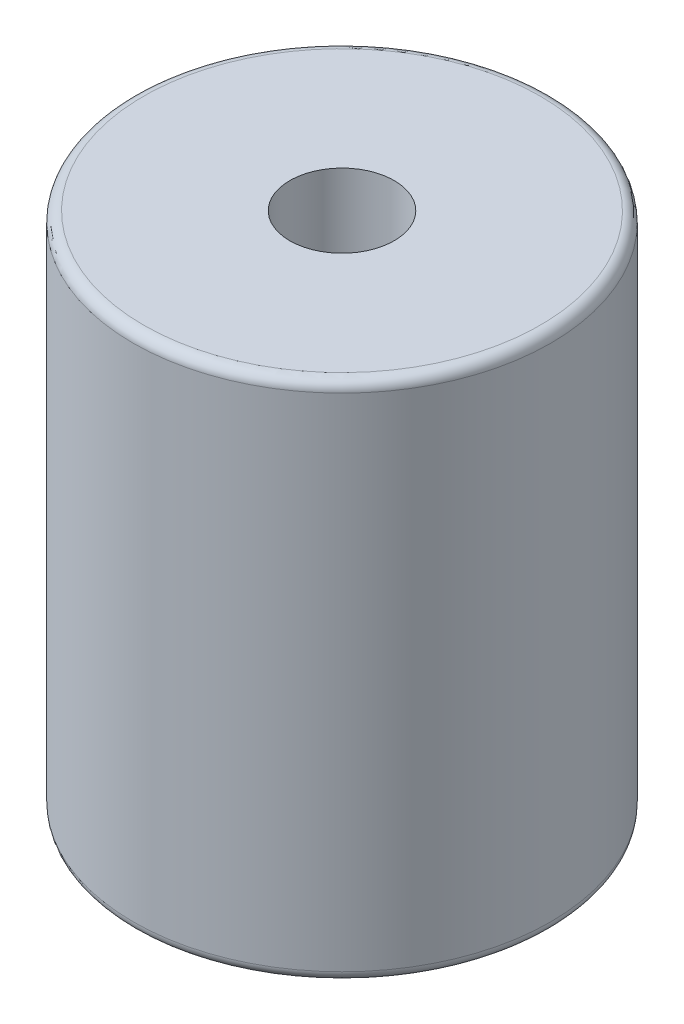
ISO-10303-21;
HEADER;
FILE_DESCRIPTION(('STEP AP214'),'2;1');
FILE_NAME('part.step','',(''),(''),'','','');
FILE_SCHEMA(('AUTOMOTIVE_DESIGN { 1 0 10303 214 1 1 1 1 }'));
ENDSEC;
DATA;
#1=APPLICATION_CONTEXT('core data for automotive mechanical design processes');
#2=APPLICATION_PROTOCOL_DEFINITION('international standard','automotive_design',2000,#1);
#3=PRODUCT_CONTEXT('',#1,'mechanical');
#4=PRODUCT('Part','Part','',(#3));
#5=PRODUCT_RELATED_PRODUCT_CATEGORY('part','',(#4));
#6=PRODUCT_DEFINITION_FORMATION('','',#4);
#7=PRODUCT_DEFINITION_CONTEXT('part definition',#1,'design');
#8=PRODUCT_DEFINITION('design','',#6,#7);
#9=PRODUCT_DEFINITION_SHAPE('','',#8);
#10=(LENGTH_UNIT() NAMED_UNIT(*) SI_UNIT(.MILLI.,.METRE.));
#11=(NAMED_UNIT(*) PLANE_ANGLE_UNIT() SI_UNIT($,.RADIAN.));
#12=(NAMED_UNIT(*) SI_UNIT($,.STERADIAN.) SOLID_ANGLE_UNIT());
#13=UNCERTAINTY_MEASURE_WITH_UNIT(LENGTH_MEASURE(1.E-05),#10,'distance_accuracy_value','');
#14=(GEOMETRIC_REPRESENTATION_CONTEXT(3) GLOBAL_UNCERTAINTY_ASSIGNED_CONTEXT((#13)) GLOBAL_UNIT_ASSIGNED_CONTEXT((#10,
#11,#12)) REPRESENTATION_CONTEXT('',''));
#15=CARTESIAN_POINT('',(0.,0.,0.));
#16=DIRECTION('',(0.,0.,1.));
#17=DIRECTION('',(1.,0.,0.));
#18=AXIS2_PLACEMENT_3D('',#15,#16,#17);
#19=CARTESIAN_POINT('',(0.,0.5,0.));
#20=DIRECTION('',(0.,1.,0.));
#21=DIRECTION('',(0.,0.,1.));
#22=AXIS2_PLACEMENT_3D('',#19,#20,#21);
#23=TOROIDAL_SURFACE('',#22,9.5,0.5);
#24=CARTESIAN_POINT('',(0.,0.5,0.));
#25=DIRECTION('',(0.,1.,0.));
#26=DIRECTION('',(0.,0.,1.));
#27=AXIS2_PLACEMENT_3D('',#24,#25,#26);
#28=CIRCLE('',#27,10.);
#29=CARTESIAN_POINT('',(0.,0.5,10.));
#30=VERTEX_POINT('',#29);
#31=EDGE_CURVE('E37',#30,#30,#28,.T.);
#32=ORIENTED_EDGE('',*,*,#31,.F.);
#33=EDGE_LOOP('',(#32));
#34=FACE_BOUND('',#33,.T.);
#35=CARTESIAN_POINT('',(0.,0.,0.));
#36=DIRECTION('',(0.,1.,0.));
#37=DIRECTION('',(0.,0.,1.));
#38=AXIS2_PLACEMENT_3D('',#35,#36,#37);
#39=CIRCLE('',#38,9.5);
#40=CARTESIAN_POINT('',(0.,0.,9.5));
#41=VERTEX_POINT('',#40);
#42=EDGE_CURVE('E10',#41,#41,#39,.F.);
#43=ORIENTED_EDGE('',*,*,#42,.F.);
#44=EDGE_LOOP('',(#43));
#45=FACE_BOUND('',#44,.T.);
#46=ADVANCED_FACE('F31',(#34,#45),#23,.T.);
#47=CARTESIAN_POINT('',(0.,24.5,0.));
#48=DIRECTION('',(0.,1.,0.));
#49=DIRECTION('',(0.,0.,1.));
#50=AXIS2_PLACEMENT_3D('',#47,#48,#49);
#51=TOROIDAL_SURFACE('',#50,9.5,0.5);
#52=CARTESIAN_POINT('',(0.,25.,0.));
#53=DIRECTION('',(0.,1.,0.));
#54=DIRECTION('',(0.,0.,1.));
#55=AXIS2_PLACEMENT_3D('',#52,#53,#54);
#56=CIRCLE('',#55,9.5);
#57=CARTESIAN_POINT('',(0.,25.,9.5));
#58=VERTEX_POINT('',#57);
#59=EDGE_CURVE('E45',#58,#58,#56,.T.);
#60=ORIENTED_EDGE('',*,*,#59,.F.);
#61=EDGE_LOOP('',(#60));
#62=FACE_BOUND('',#61,.T.);
#63=CARTESIAN_POINT('',(0.,24.5,0.));
#64=DIRECTION('',(0.,1.,0.));
#65=DIRECTION('',(0.,0.,1.));
#66=AXIS2_PLACEMENT_3D('',#63,#64,#65);
#67=CIRCLE('',#66,10.);
#68=CARTESIAN_POINT('',(0.,24.5,10.));
#69=VERTEX_POINT('',#68);
#70=EDGE_CURVE('E41',#69,#69,#67,.F.);
#71=ORIENTED_EDGE('',*,*,#70,.F.);
#72=EDGE_LOOP('',(#71));
#73=FACE_BOUND('',#72,.T.);
#74=ADVANCED_FACE('F80',(#62,#73),#51,.T.);
#75=CARTESIAN_POINT('',(0.,25.,0.));
#76=DIRECTION('',(0.,-1.,0.));
#77=DIRECTION('',(0.,0.,-1.));
#78=AXIS2_PLACEMENT_3D('',#75,#76,#77);
#79=CYLINDRICAL_SURFACE('',#78,10.);
#80=ORIENTED_EDGE('',*,*,#31,.T.);
#81=EDGE_LOOP('',(#80));
#82=FACE_BOUND('',#81,.T.);
#83=ORIENTED_EDGE('',*,*,#70,.T.);
#84=EDGE_LOOP('',(#83));
#85=FACE_BOUND('',#84,.T.);
#86=ADVANCED_FACE('F76',(#82,#85),#79,.T.);
#87=CARTESIAN_POINT('',(0.,25.,0.));
#88=DIRECTION('',(0.,1.,0.));
#89=DIRECTION('',(0.,0.,1.));
#90=AXIS2_PLACEMENT_3D('',#87,#88,#89);
#91=PLANE('',#90);
#92=CARTESIAN_POINT('',(0.,25.,0.));
#93=DIRECTION('',(0.,1.,0.));
#94=DIRECTION('',(0.,0.,1.));
#95=AXIS2_PLACEMENT_3D('',#92,#93,#94);
#96=CIRCLE('',#95,2.5);
#97=CARTESIAN_POINT('',(0.,25.,2.5));
#98=VERTEX_POINT('',#97);
#99=EDGE_CURVE('E57',#98,#98,#96,.T.);
#100=ORIENTED_EDGE('',*,*,#99,.F.);
#101=EDGE_LOOP('',(#100));
#102=FACE_BOUND('',#101,.T.);
#103=ORIENTED_EDGE('',*,*,#59,.T.);
#104=EDGE_LOOP('',(#103));
#105=FACE_BOUND('',#104,.T.);
#106=ADVANCED_FACE('F72',(#102,#105),#91,.T.);
#107=CARTESIAN_POINT('',(0.,0.,0.));
#108=DIRECTION('',(0.,1.,0.));
#109=DIRECTION('',(0.,0.,1.));
#110=AXIS2_PLACEMENT_3D('',#107,#108,#109);
#111=PLANE('',#110);
#112=CARTESIAN_POINT('',(0.,0.,0.));
#113=DIRECTION('',(0.,-1.,0.));
#114=DIRECTION('',(0.,0.,-1.));
#115=AXIS2_PLACEMENT_3D('',#112,#113,#114);
#116=CIRCLE('',#115,4.);
#117=CARTESIAN_POINT('',(0.,0.,-4.));
#118=VERTEX_POINT('',#117);
#119=EDGE_CURVE('E51',#118,#118,#116,.T.);
#120=ORIENTED_EDGE('',*,*,#119,.F.);
#121=EDGE_LOOP('',(#120));
#122=FACE_BOUND('',#121,.T.);
#123=ORIENTED_EDGE('',*,*,#42,.T.);
#124=EDGE_LOOP('',(#123));
#125=FACE_BOUND('',#124,.T.);
#126=ADVANCED_FACE('F75',(#122,#125),#111,.F.);
#127=CARTESIAN_POINT('',(0.,12.5,0.));
#128=DIRECTION('',(0.,-1.,0.));
#129=DIRECTION('',(0.,0.,-1.));
#130=AXIS2_PLACEMENT_3D('',#127,#128,#129);
#131=CYLINDRICAL_SURFACE('',#130,4.);
#132=CARTESIAN_POINT('',(0.,12.5,0.));
#133=DIRECTION('',(0.,-1.,0.));
#134=DIRECTION('',(0.,0.,-1.));
#135=AXIS2_PLACEMENT_3D('',#132,#133,#134);
#136=CIRCLE('',#135,4.);
#137=CARTESIAN_POINT('',(0.,12.5,-4.));
#138=VERTEX_POINT('',#137);
#139=EDGE_CURVE('E50',#138,#138,#136,.T.);
#140=ORIENTED_EDGE('',*,*,#139,.F.);
#141=EDGE_LOOP('',(#140));
#142=FACE_BOUND('',#141,.T.);
#143=ORIENTED_EDGE('',*,*,#119,.T.);
#144=EDGE_LOOP('',(#143));
#145=FACE_BOUND('',#144,.T.);
#146=ADVANCED_FACE('F111',(#142,#145),#131,.F.);
#147=CARTESIAN_POINT('',(0.,12.5,0.));
#148=DIRECTION('',(0.,-1.,0.));
#149=DIRECTION('',(0.,0.,-1.));
#150=AXIS2_PLACEMENT_3D('',#147,#148,#149);
#151=PLANE('',#150);
#152=CARTESIAN_POINT('',(0.,12.5,0.));
#153=DIRECTION('',(0.,1.,0.));
#154=DIRECTION('',(0.,0.,1.));
#155=AXIS2_PLACEMENT_3D('',#152,#153,#154);
#156=CIRCLE('',#155,2.5);
#157=CARTESIAN_POINT('',(0.,12.5,2.5));
#158=VERTEX_POINT('',#157);
#159=EDGE_CURVE('E54',#158,#158,#156,.T.);
#160=ORIENTED_EDGE('',*,*,#159,.T.);
#161=EDGE_LOOP('',(#160));
#162=FACE_BOUND('',#161,.T.);
#163=ORIENTED_EDGE('',*,*,#139,.T.);
#164=EDGE_LOOP('',(#163));
#165=FACE_BOUND('',#164,.T.);
#166=ADVANCED_FACE('F63',(#162,#165),#151,.T.);
#167=CARTESIAN_POINT('',(0.,12.5,0.));
#168=DIRECTION('',(0.,1.,0.));
#169=DIRECTION('',(0.,0.,1.));
#170=AXIS2_PLACEMENT_3D('',#167,#168,#169);
#171=CYLINDRICAL_SURFACE('',#170,2.5);
#172=ORIENTED_EDGE('',*,*,#159,.F.);
#173=EDGE_LOOP('',(#172));
#174=FACE_BOUND('',#173,.T.);
#175=ORIENTED_EDGE('',*,*,#99,.T.);
#176=EDGE_LOOP('',(#175));
#177=FACE_BOUND('',#176,.T.);
#178=ADVANCED_FACE('F66',(#174,#177),#171,.F.);
#179=CLOSED_SHELL('',(#46,#74,#86,#106,#126,#146,#166,#178));
#180=MANIFOLD_SOLID_BREP('B2',#179);
#181=ADVANCED_BREP_SHAPE_REPRESENTATION('',(#18,#180),#14);
#182=SHAPE_DEFINITION_REPRESENTATION(#9,#181);
ENDSEC;
END-ISO-10303-21;
